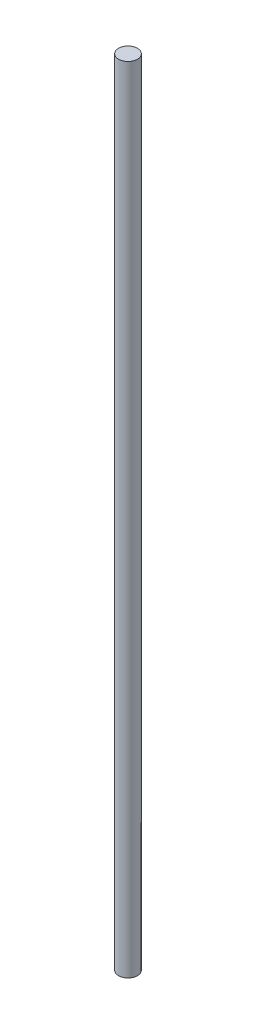
ISO-10303-21;
HEADER;
FILE_DESCRIPTION(('STEP AP214'),'2;1');
FILE_NAME('part.step','',(''),(''),'','','');
FILE_SCHEMA(('AUTOMOTIVE_DESIGN { 1 0 10303 214 1 1 1 1 }'));
ENDSEC;
DATA;
#1=APPLICATION_CONTEXT('core data for automotive mechanical design processes');
#2=APPLICATION_PROTOCOL_DEFINITION('international standard','automotive_design',2000,#1);
#3=PRODUCT_CONTEXT('',#1,'mechanical');
#4=PRODUCT('Part','Part','',(#3));
#5=PRODUCT_RELATED_PRODUCT_CATEGORY('part','',(#4));
#6=PRODUCT_DEFINITION_FORMATION('','',#4);
#7=PRODUCT_DEFINITION_CONTEXT('part definition',#1,'design');
#8=PRODUCT_DEFINITION('design','',#6,#7);
#9=PRODUCT_DEFINITION_SHAPE('','',#8);
#10=(LENGTH_UNIT() NAMED_UNIT(*) SI_UNIT(.MILLI.,.METRE.));
#11=(NAMED_UNIT(*) PLANE_ANGLE_UNIT() SI_UNIT($,.RADIAN.));
#12=(NAMED_UNIT(*) SI_UNIT($,.STERADIAN.) SOLID_ANGLE_UNIT());
#13=UNCERTAINTY_MEASURE_WITH_UNIT(LENGTH_MEASURE(1.E-05),#10,'distance_accuracy_value','');
#14=(GEOMETRIC_REPRESENTATION_CONTEXT(3) GLOBAL_UNCERTAINTY_ASSIGNED_CONTEXT((#13)) GLOBAL_UNIT_ASSIGNED_CONTEXT((#10,
#11,#12)) REPRESENTATION_CONTEXT('',''));
#15=CARTESIAN_POINT('',(0.,0.,0.));
#16=DIRECTION('',(0.,0.,1.));
#17=DIRECTION('',(1.,0.,0.));
#18=AXIS2_PLACEMENT_3D('',#15,#16,#17);
#19=CARTESIAN_POINT('',(0.,2133.6,0.));
#20=DIRECTION('',(0.,-1.,0.));
#21=DIRECTION('',(0.,0.,-1.));
#22=AXIS2_PLACEMENT_3D('',#19,#20,#21);
#23=CYLINDRICAL_SURFACE('',#22,25.4);
#24=CARTESIAN_POINT('',(0.,2133.6,0.));
#25=DIRECTION('',(0.,1.,0.));
#26=DIRECTION('',(0.,0.,1.));
#27=AXIS2_PLACEMENT_3D('',#24,#25,#26);
#28=CIRCLE('',#27,25.4);
#29=CARTESIAN_POINT('',(0.,2133.6,25.4));
#30=VERTEX_POINT('',#29);
#31=EDGE_CURVE('E10',#30,#30,#28,.T.);
#32=ORIENTED_EDGE('',*,*,#31,.F.);
#33=EDGE_LOOP('',(#32));
#34=FACE_BOUND('',#33,.T.);
#35=CARTESIAN_POINT('',(0.,0.,0.));
#36=DIRECTION('',(0.,1.,0.));
#37=DIRECTION('',(0.,0.,1.));
#38=AXIS2_PLACEMENT_3D('',#35,#36,#37);
#39=CIRCLE('',#38,25.4);
#40=CARTESIAN_POINT('',(0.,0.,25.4));
#41=VERTEX_POINT('',#40);
#42=EDGE_CURVE('E40',#41,#41,#39,.T.);
#43=ORIENTED_EDGE('',*,*,#42,.T.);
#44=EDGE_LOOP('',(#43));
#45=FACE_BOUND('',#44,.T.);
#46=ADVANCED_FACE('F37',(#34,#45),#23,.T.);
#47=CARTESIAN_POINT('',(0.,2133.6,0.));
#48=DIRECTION('',(0.,1.,0.));
#49=DIRECTION('',(0.,0.,1.));
#50=AXIS2_PLACEMENT_3D('',#47,#48,#49);
#51=PLANE('',#50);
#52=ORIENTED_EDGE('',*,*,#31,.T.);
#53=EDGE_LOOP('',(#52));
#54=FACE_BOUND('',#53,.T.);
#55=ADVANCED_FACE('F54',(#54),#51,.T.);
#56=CARTESIAN_POINT('',(0.,0.,0.));
#57=DIRECTION('',(0.,1.,0.));
#58=DIRECTION('',(0.,0.,1.));
#59=AXIS2_PLACEMENT_3D('',#56,#57,#58);
#60=PLANE('',#59);
#61=ORIENTED_EDGE('',*,*,#42,.F.);
#62=EDGE_LOOP('',(#61));
#63=FACE_BOUND('',#62,.T.);
#64=ADVANCED_FACE('F52',(#63),#60,.F.);
#65=CLOSED_SHELL('',(#46,#55,#64));
#66=MANIFOLD_SOLID_BREP('B2',#65);
#67=ADVANCED_BREP_SHAPE_REPRESENTATION('',(#18,#66),#14);
#68=SHAPE_DEFINITION_REPRESENTATION(#9,#67);
ENDSEC;
END-ISO-10303-21;
